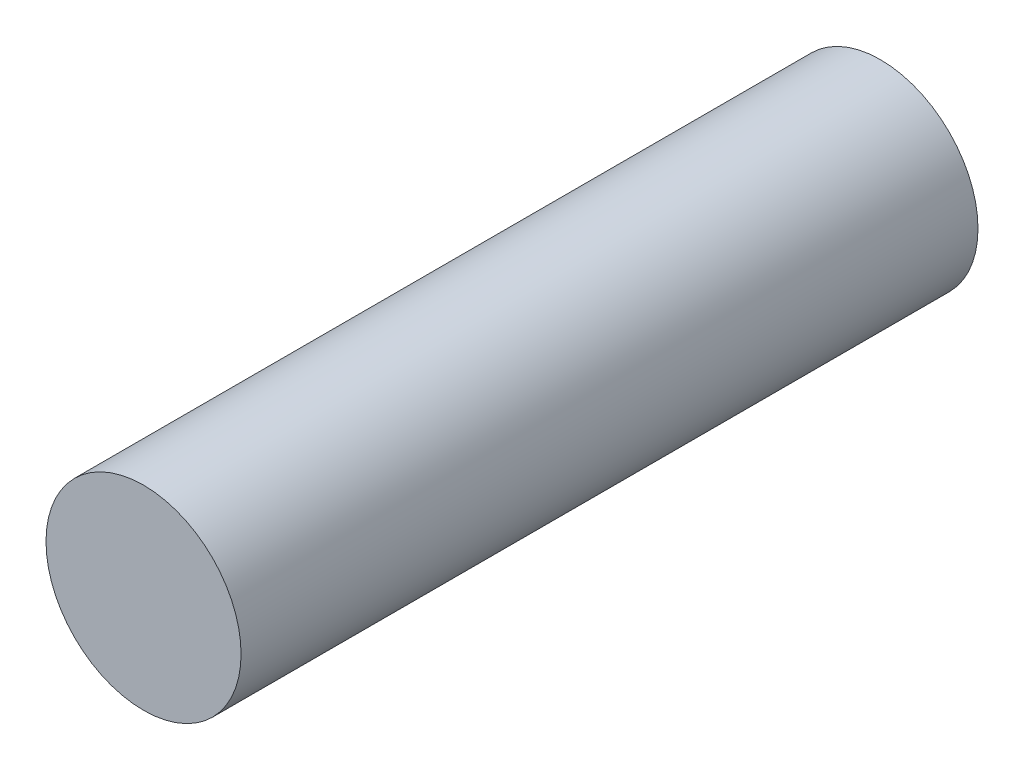
ISO-10303-21;
HEADER;
FILE_DESCRIPTION(('STEP AP214'),'2;1');
FILE_NAME('part.step','',(''),(''),'','','');
FILE_SCHEMA(('AUTOMOTIVE_DESIGN { 1 0 10303 214 1 1 1 1 }'));
ENDSEC;
DATA;
#1=APPLICATION_CONTEXT('core data for automotive mechanical design processes');
#2=APPLICATION_PROTOCOL_DEFINITION('international standard','automotive_design',2000,#1);
#3=PRODUCT_CONTEXT('',#1,'mechanical');
#4=PRODUCT('Part','Part','',(#3));
#5=PRODUCT_RELATED_PRODUCT_CATEGORY('part','',(#4));
#6=PRODUCT_DEFINITION_FORMATION('','',#4);
#7=PRODUCT_DEFINITION_CONTEXT('part definition',#1,'design');
#8=PRODUCT_DEFINITION('design','',#6,#7);
#9=PRODUCT_DEFINITION_SHAPE('','',#8);
#10=(LENGTH_UNIT() NAMED_UNIT(*) SI_UNIT(.MILLI.,.METRE.));
#11=(NAMED_UNIT(*) PLANE_ANGLE_UNIT() SI_UNIT($,.RADIAN.));
#12=(NAMED_UNIT(*) SI_UNIT($,.STERADIAN.) SOLID_ANGLE_UNIT());
#13=UNCERTAINTY_MEASURE_WITH_UNIT(LENGTH_MEASURE(1.E-05),#10,'distance_accuracy_value','');
#14=(GEOMETRIC_REPRESENTATION_CONTEXT(3) GLOBAL_UNCERTAINTY_ASSIGNED_CONTEXT((#13)) GLOBAL_UNIT_ASSIGNED_CONTEXT((#10,
#11,#12)) REPRESENTATION_CONTEXT('',''));
#15=CARTESIAN_POINT('',(0.,0.,0.));
#16=DIRECTION('',(0.,0.,1.));
#17=DIRECTION('',(1.,0.,0.));
#18=AXIS2_PLACEMENT_3D('',#15,#16,#17);
#19=CARTESIAN_POINT('',(0.,0.,17.));
#20=DIRECTION('',(0.,0.,-1.));
#21=DIRECTION('',(-1.,0.,0.));
#22=AXIS2_PLACEMENT_3D('',#19,#20,#21);
#23=CYLINDRICAL_SURFACE('',#22,2.25);
#24=CARTESIAN_POINT('',(0.,0.,17.));
#25=DIRECTION('',(0.,0.,1.));
#26=DIRECTION('',(1.,0.,0.));
#27=AXIS2_PLACEMENT_3D('',#24,#25,#26);
#28=CIRCLE('',#27,2.25);
#29=CARTESIAN_POINT('',(2.25,0.,17.));
#30=VERTEX_POINT('',#29);
#31=EDGE_CURVE('E10',#30,#30,#28,.T.);
#32=ORIENTED_EDGE('',*,*,#31,.F.);
#33=EDGE_LOOP('',(#32));
#34=FACE_BOUND('',#33,.T.);
#35=CARTESIAN_POINT('',(0.,0.,0.));
#36=DIRECTION('',(0.,0.,1.));
#37=DIRECTION('',(1.,0.,0.));
#38=AXIS2_PLACEMENT_3D('',#35,#36,#37);
#39=CIRCLE('',#38,2.25);
#40=CARTESIAN_POINT('',(2.25,0.,0.));
#41=VERTEX_POINT('',#40);
#42=EDGE_CURVE('E38',#41,#41,#39,.T.);
#43=ORIENTED_EDGE('',*,*,#42,.T.);
#44=EDGE_LOOP('',(#43));
#45=FACE_BOUND('',#44,.T.);
#46=ADVANCED_FACE('F35',(#34,#45),#23,.T.);
#47=CARTESIAN_POINT('',(0.,0.,17.));
#48=DIRECTION('',(0.,0.,1.));
#49=DIRECTION('',(1.,0.,0.));
#50=AXIS2_PLACEMENT_3D('',#47,#48,#49);
#51=PLANE('',#50);
#52=ORIENTED_EDGE('',*,*,#31,.T.);
#53=EDGE_LOOP('',(#52));
#54=FACE_BOUND('',#53,.T.);
#55=ADVANCED_FACE('F50',(#54),#51,.T.);
#56=CARTESIAN_POINT('',(0.,0.,0.));
#57=DIRECTION('',(0.,0.,1.));
#58=DIRECTION('',(1.,0.,0.));
#59=AXIS2_PLACEMENT_3D('',#56,#57,#58);
#60=PLANE('',#59);
#61=ORIENTED_EDGE('',*,*,#42,.F.);
#62=EDGE_LOOP('',(#61));
#63=FACE_BOUND('',#62,.T.);
#64=ADVANCED_FACE('F48',(#63),#60,.F.);
#65=CLOSED_SHELL('',(#46,#55,#64));
#66=MANIFOLD_SOLID_BREP('B2',#65);
#67=ADVANCED_BREP_SHAPE_REPRESENTATION('',(#18,#66),#14);
#68=SHAPE_DEFINITION_REPRESENTATION(#9,#67);
ENDSEC;
END-ISO-10303-21;
